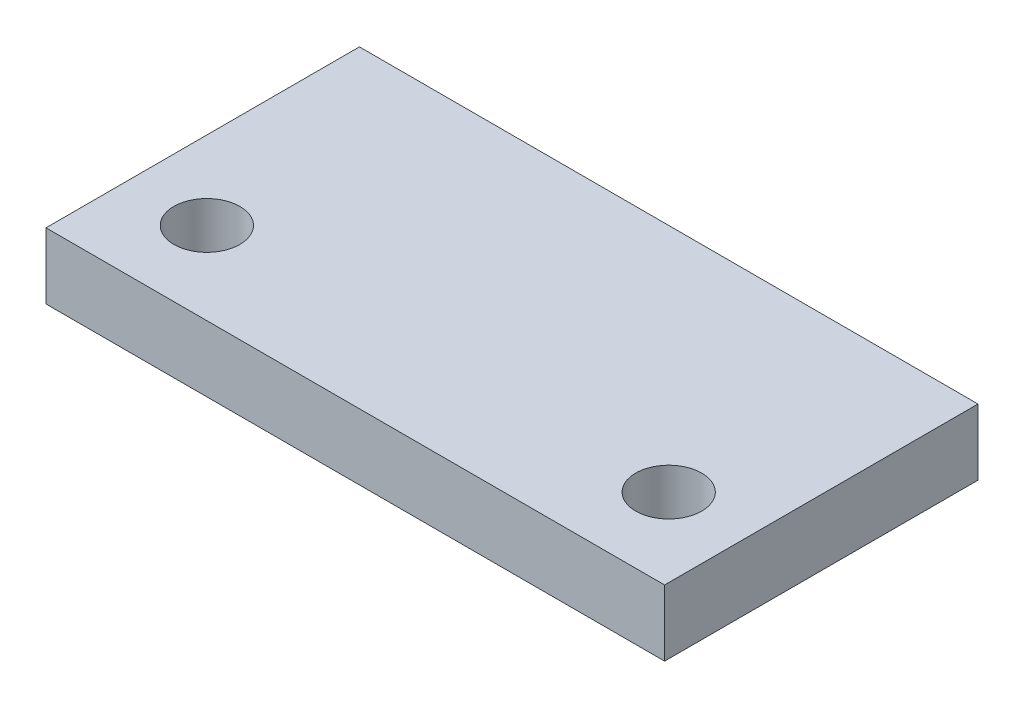
ISO-10303-21;
HEADER;
FILE_DESCRIPTION(('STEP AP214'),'2;1');
FILE_NAME('part.step','',(''),(''),'','','');
FILE_SCHEMA(('AUTOMOTIVE_DESIGN { 1 0 10303 214 1 1 1 1 }'));
ENDSEC;
DATA;
#1=APPLICATION_CONTEXT('core data for automotive mechanical design processes');
#2=APPLICATION_PROTOCOL_DEFINITION('international standard','automotive_design',2000,#1);
#3=PRODUCT_CONTEXT('',#1,'mechanical');
#4=PRODUCT('Part','Part','',(#3));
#5=PRODUCT_RELATED_PRODUCT_CATEGORY('part','',(#4));
#6=PRODUCT_DEFINITION_FORMATION('','',#4);
#7=PRODUCT_DEFINITION_CONTEXT('part definition',#1,'design');
#8=PRODUCT_DEFINITION('design','',#6,#7);
#9=PRODUCT_DEFINITION_SHAPE('','',#8);
#10=(LENGTH_UNIT() NAMED_UNIT(*) SI_UNIT(.MILLI.,.METRE.));
#11=(NAMED_UNIT(*) PLANE_ANGLE_UNIT() SI_UNIT($,.RADIAN.));
#12=(NAMED_UNIT(*) SI_UNIT($,.STERADIAN.) SOLID_ANGLE_UNIT());
#13=UNCERTAINTY_MEASURE_WITH_UNIT(LENGTH_MEASURE(1.E-05),#10,'distance_accuracy_value','');
#14=(GEOMETRIC_REPRESENTATION_CONTEXT(3) GLOBAL_UNCERTAINTY_ASSIGNED_CONTEXT((#13)) GLOBAL_UNIT_ASSIGNED_CONTEXT((#10,
#11,#12)) REPRESENTATION_CONTEXT('',''));
#15=CARTESIAN_POINT('',(0.,0.,0.));
#16=DIRECTION('',(0.,0.,1.));
#17=DIRECTION('',(1.,0.,0.));
#18=AXIS2_PLACEMENT_3D('',#15,#16,#17);
#19=CARTESIAN_POINT('',(-37.5,0.,38.));
#20=DIRECTION('',(1.,0.,0.));
#21=DIRECTION('',(0.,1.,0.));
#22=AXIS2_PLACEMENT_3D('',#19,#20,#21);
#23=PLANE('',#22);
#24=DIRECTION('',(0.,-1.,0.));
#25=VECTOR('',#24,1.);
#26=CARTESIAN_POINT('',(-37.5,0.,0.));
#27=LINE('',#26,#25);
#28=CARTESIAN_POINT('',(-37.5,0.,0.));
#29=VERTEX_POINT('',#28);
#30=CARTESIAN_POINT('',(-37.5,-8.,0.));
#31=VERTEX_POINT('',#30);
#32=EDGE_CURVE('E110',#29,#31,#27,.T.);
#33=ORIENTED_EDGE('',*,*,#32,.T.);
#34=DIRECTION('',(0.,0.,-1.));
#35=VECTOR('',#34,1.);
#36=CARTESIAN_POINT('',(-37.5,-8.,38.));
#37=LINE('',#36,#35);
#38=CARTESIAN_POINT('',(-37.5,-8.,38.));
#39=VERTEX_POINT('',#38);
#40=EDGE_CURVE('E11',#39,#31,#37,.T.);
#41=ORIENTED_EDGE('',*,*,#40,.F.);
#42=DIRECTION('',(0.,-1.,0.));
#43=VECTOR('',#42,1.);
#44=CARTESIAN_POINT('',(-37.5,0.,38.));
#45=LINE('',#44,#43);
#46=CARTESIAN_POINT('',(-37.5,0.,38.));
#47=VERTEX_POINT('',#46);
#48=EDGE_CURVE('E93',#47,#39,#45,.T.);
#49=ORIENTED_EDGE('',*,*,#48,.F.);
#50=DIRECTION('',(0.,0.,-1.));
#51=VECTOR('',#50,1.);
#52=CARTESIAN_POINT('',(-37.5,0.,38.));
#53=LINE('',#52,#51);
#54=EDGE_CURVE('E106',#47,#29,#53,.T.);
#55=ORIENTED_EDGE('',*,*,#54,.T.);
#56=EDGE_LOOP('',(#33,#41,#49,#55));
#57=FACE_BOUND('',#56,.T.);
#58=ADVANCED_FACE('F39',(#57),#23,.F.);
#59=CARTESIAN_POINT('',(-37.5,-8.,38.));
#60=DIRECTION('',(0.,1.,0.));
#61=DIRECTION('',(-1.,0.,0.));
#62=AXIS2_PLACEMENT_3D('',#59,#60,#61);
#63=PLANE('',#62);
#64=CARTESIAN_POINT('',(-28.,-8.00000000000001,28.));
#65=DIRECTION('',(0.,1.,0.));
#66=DIRECTION('',(-1.,0.,0.));
#67=AXIS2_PLACEMENT_3D('',#64,#65,#66);
#68=CIRCLE('',#67,4.);
#69=CARTESIAN_POINT('',(-32.,-8.00000000000001,28.));
#70=VERTEX_POINT('',#69);
#71=EDGE_CURVE('E126',#70,#70,#68,.T.);
#72=ORIENTED_EDGE('',*,*,#71,.T.);
#73=EDGE_LOOP('',(#72));
#74=FACE_BOUND('',#73,.T.);
#75=CARTESIAN_POINT('',(28.,-8.,28.));
#76=DIRECTION('',(0.,1.,0.));
#77=DIRECTION('',(1.,0.,0.));
#78=AXIS2_PLACEMENT_3D('',#75,#76,#77);
#79=CIRCLE('',#78,4.);
#80=CARTESIAN_POINT('',(32.,-8.,28.));
#81=VERTEX_POINT('',#80);
#82=EDGE_CURVE('E133',#81,#81,#79,.T.);
#83=ORIENTED_EDGE('',*,*,#82,.T.);
#84=EDGE_LOOP('',(#83));
#85=FACE_BOUND('',#84,.T.);
#86=DIRECTION('',(1.,0.,0.));
#87=VECTOR('',#86,1.);
#88=CARTESIAN_POINT('',(-37.5,-8.,0.));
#89=LINE('',#88,#87);
#90=CARTESIAN_POINT('',(37.5,-7.99999999999998,0.));
#91=VERTEX_POINT('',#90);
#92=EDGE_CURVE('E98',#31,#91,#89,.T.);
#93=ORIENTED_EDGE('',*,*,#92,.T.);
#94=DIRECTION('',(0.,0.,-1.));
#95=VECTOR('',#94,1.);
#96=CARTESIAN_POINT('',(37.5,-7.99999999999998,38.));
#97=LINE('',#96,#95);
#98=CARTESIAN_POINT('',(37.5,-7.99999999999998,38.));
#99=VERTEX_POINT('',#98);
#100=EDGE_CURVE('E49',#99,#91,#97,.T.);
#101=ORIENTED_EDGE('',*,*,#100,.F.);
#102=DIRECTION('',(1.,0.,0.));
#103=VECTOR('',#102,1.);
#104=CARTESIAN_POINT('',(-37.5,-8.,38.));
#105=LINE('',#104,#103);
#106=EDGE_CURVE('E88',#39,#99,#105,.T.);
#107=ORIENTED_EDGE('',*,*,#106,.F.);
#108=ORIENTED_EDGE('',*,*,#40,.T.);
#109=EDGE_LOOP('',(#93,#101,#107,#108));
#110=FACE_BOUND('',#109,.T.);
#111=ADVANCED_FACE('F97',(#74,#85,#110),#63,.F.);
#112=CARTESIAN_POINT('',(37.5,-7.99999999999998,38.));
#113=DIRECTION('',(-1.,0.,0.));
#114=DIRECTION('',(0.,-1.,0.));
#115=AXIS2_PLACEMENT_3D('',#112,#113,#114);
#116=PLANE('',#115);
#117=DIRECTION('',(0.,1.,0.));
#118=VECTOR('',#117,1.);
#119=CARTESIAN_POINT('',(37.5,-7.99999999999998,0.));
#120=LINE('',#119,#118);
#121=CARTESIAN_POINT('',(37.5,0.,0.));
#122=VERTEX_POINT('',#121);
#123=EDGE_CURVE('E75',#91,#122,#120,.T.);
#124=ORIENTED_EDGE('',*,*,#123,.T.);
#125=DIRECTION('',(0.,0.,-1.));
#126=VECTOR('',#125,1.);
#127=CARTESIAN_POINT('',(37.5,0.,38.));
#128=LINE('',#127,#126);
#129=CARTESIAN_POINT('',(37.5,0.,38.));
#130=VERTEX_POINT('',#129);
#131=EDGE_CURVE('E100',#130,#122,#128,.T.);
#132=ORIENTED_EDGE('',*,*,#131,.F.);
#133=DIRECTION('',(0.,1.,0.));
#134=VECTOR('',#133,1.);
#135=CARTESIAN_POINT('',(37.5,-7.99999999999998,38.));
#136=LINE('',#135,#134);
#137=EDGE_CURVE('E91',#99,#130,#136,.T.);
#138=ORIENTED_EDGE('',*,*,#137,.F.);
#139=ORIENTED_EDGE('',*,*,#100,.T.);
#140=EDGE_LOOP('',(#124,#132,#138,#139));
#141=FACE_BOUND('',#140,.T.);
#142=ADVANCED_FACE('F102',(#141),#116,.F.);
#143=CARTESIAN_POINT('',(-37.5,0.,38.));
#144=DIRECTION('',(0.,-1.,0.));
#145=DIRECTION('',(1.,0.,0.));
#146=AXIS2_PLACEMENT_3D('',#143,#144,#145);
#147=PLANE('',#146);
#148=CARTESIAN_POINT('',(-28.,0.,28.));
#149=DIRECTION('',(0.,-1.,0.));
#150=DIRECTION('',(1.,0.,0.));
#151=AXIS2_PLACEMENT_3D('',#148,#149,#150);
#152=CIRCLE('',#151,4.);
#153=CARTESIAN_POINT('',(-24.,0.,28.));
#154=VERTEX_POINT('',#153);
#155=EDGE_CURVE('E42',#154,#154,#152,.T.);
#156=ORIENTED_EDGE('',*,*,#155,.T.);
#157=EDGE_LOOP('',(#156));
#158=FACE_BOUND('',#157,.T.);
#159=CARTESIAN_POINT('',(28.,0.,28.));
#160=DIRECTION('',(0.,-1.,0.));
#161=DIRECTION('',(1.,0.,0.));
#162=AXIS2_PLACEMENT_3D('',#159,#160,#161);
#163=CIRCLE('',#162,4.);
#164=CARTESIAN_POINT('',(32.,0.,28.));
#165=VERTEX_POINT('',#164);
#166=EDGE_CURVE('E123',#165,#165,#163,.T.);
#167=ORIENTED_EDGE('',*,*,#166,.T.);
#168=EDGE_LOOP('',(#167));
#169=FACE_BOUND('',#168,.T.);
#170=DIRECTION('',(-1.,0.,0.));
#171=VECTOR('',#170,1.);
#172=CARTESIAN_POINT('',(-37.5,0.,0.));
#173=LINE('',#172,#171);
#174=EDGE_CURVE('E81',#122,#29,#173,.T.);
#175=ORIENTED_EDGE('',*,*,#174,.T.);
#176=ORIENTED_EDGE('',*,*,#54,.F.);
#177=DIRECTION('',(-1.,0.,0.));
#178=VECTOR('',#177,1.);
#179=CARTESIAN_POINT('',(-37.5,0.,38.));
#180=LINE('',#179,#178);
#181=EDGE_CURVE('E58',#130,#47,#180,.T.);
#182=ORIENTED_EDGE('',*,*,#181,.F.);
#183=ORIENTED_EDGE('',*,*,#131,.T.);
#184=EDGE_LOOP('',(#175,#176,#182,#183));
#185=FACE_BOUND('',#184,.T.);
#186=ADVANCED_FACE('F165',(#158,#169,#185),#147,.F.);
#187=CARTESIAN_POINT('',(0.,0.,38.));
#188=DIRECTION('',(0.,0.,1.));
#189=DIRECTION('',(1.,0.,0.));
#190=AXIS2_PLACEMENT_3D('',#187,#188,#189);
#191=PLANE('',#190);
#192=ORIENTED_EDGE('',*,*,#48,.T.);
#193=ORIENTED_EDGE('',*,*,#106,.T.);
#194=ORIENTED_EDGE('',*,*,#137,.T.);
#195=ORIENTED_EDGE('',*,*,#181,.T.);
#196=EDGE_LOOP('',(#192,#193,#194,#195));
#197=FACE_BOUND('',#196,.T.);
#198=ADVANCED_FACE('F89',(#197),#191,.T.);
#199=CARTESIAN_POINT('',(0.,0.,0.));
#200=DIRECTION('',(0.,0.,1.));
#201=DIRECTION('',(1.,0.,0.));
#202=AXIS2_PLACEMENT_3D('',#199,#200,#201);
#203=PLANE('',#202);
#204=ORIENTED_EDGE('',*,*,#32,.F.);
#205=ORIENTED_EDGE('',*,*,#174,.F.);
#206=ORIENTED_EDGE('',*,*,#123,.F.);
#207=ORIENTED_EDGE('',*,*,#92,.F.);
#208=EDGE_LOOP('',(#204,#205,#206,#207));
#209=FACE_BOUND('',#208,.T.);
#210=ADVANCED_FACE('F148',(#209),#203,.F.);
#211=CARTESIAN_POINT('',(28.,-8.,28.));
#212=DIRECTION('',(0.,1.,0.));
#213=DIRECTION('',(-1.,0.,0.));
#214=AXIS2_PLACEMENT_3D('',#211,#212,#213);
#215=CYLINDRICAL_SURFACE('',#214,4.);
#216=ORIENTED_EDGE('',*,*,#82,.F.);
#217=EDGE_LOOP('',(#216));
#218=FACE_BOUND('',#217,.T.);
#219=ORIENTED_EDGE('',*,*,#166,.F.);
#220=EDGE_LOOP('',(#219));
#221=FACE_BOUND('',#220,.T.);
#222=ADVANCED_FACE('F144',(#218,#221),#215,.F.);
#223=CARTESIAN_POINT('',(-28.,-8.00000000000001,28.));
#224=DIRECTION('',(0.,1.,0.));
#225=DIRECTION('',(-1.,0.,0.));
#226=AXIS2_PLACEMENT_3D('',#223,#224,#225);
#227=CYLINDRICAL_SURFACE('',#226,4.);
#228=ORIENTED_EDGE('',*,*,#71,.F.);
#229=EDGE_LOOP('',(#228));
#230=FACE_BOUND('',#229,.T.);
#231=ORIENTED_EDGE('',*,*,#155,.F.);
#232=EDGE_LOOP('',(#231));
#233=FACE_BOUND('',#232,.T.);
#234=ADVANCED_FACE('F147',(#230,#233),#227,.F.);
#235=CLOSED_SHELL('',(#58,#111,#142,#186,#198,#210,#222,#234));
#236=MANIFOLD_SOLID_BREP('B2',#235);
#237=ADVANCED_BREP_SHAPE_REPRESENTATION('',(#18,#236),#14);
#238=SHAPE_DEFINITION_REPRESENTATION(#9,#237);
ENDSEC;
END-ISO-10303-21;
